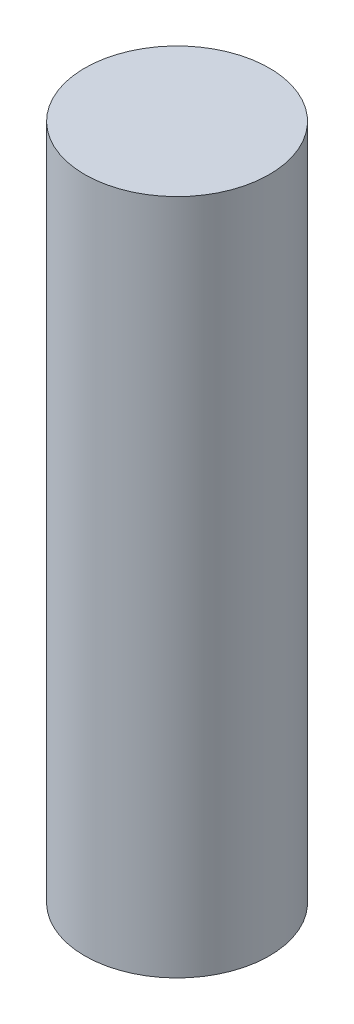
ISO-10303-21;
HEADER;
FILE_DESCRIPTION(('STEP AP214'),'2;1');
FILE_NAME('part.step','',(''),(''),'','','');
FILE_SCHEMA(('AUTOMOTIVE_DESIGN { 1 0 10303 214 1 1 1 1 }'));
ENDSEC;
DATA;
#1=APPLICATION_CONTEXT('core data for automotive mechanical design processes');
#2=APPLICATION_PROTOCOL_DEFINITION('international standard','automotive_design',2000,#1);
#3=PRODUCT_CONTEXT('',#1,'mechanical');
#4=PRODUCT('Part','Part','',(#3));
#5=PRODUCT_RELATED_PRODUCT_CATEGORY('part','',(#4));
#6=PRODUCT_DEFINITION_FORMATION('','',#4);
#7=PRODUCT_DEFINITION_CONTEXT('part definition',#1,'design');
#8=PRODUCT_DEFINITION('design','',#6,#7);
#9=PRODUCT_DEFINITION_SHAPE('','',#8);
#10=(LENGTH_UNIT() NAMED_UNIT(*) SI_UNIT(.MILLI.,.METRE.));
#11=(NAMED_UNIT(*) PLANE_ANGLE_UNIT() SI_UNIT($,.RADIAN.));
#12=(NAMED_UNIT(*) SI_UNIT($,.STERADIAN.) SOLID_ANGLE_UNIT());
#13=UNCERTAINTY_MEASURE_WITH_UNIT(LENGTH_MEASURE(1.E-05),#10,'distance_accuracy_value','');
#14=(GEOMETRIC_REPRESENTATION_CONTEXT(3) GLOBAL_UNCERTAINTY_ASSIGNED_CONTEXT((#13)) GLOBAL_UNIT_ASSIGNED_CONTEXT((#10,
#11,#12)) REPRESENTATION_CONTEXT('',''));
#15=CARTESIAN_POINT('',(0.,0.,0.));
#16=DIRECTION('',(0.,0.,1.));
#17=DIRECTION('',(1.,0.,0.));
#18=AXIS2_PLACEMENT_3D('',#15,#16,#17);
#19=CARTESIAN_POINT('',(0.,11.,0.));
#20=DIRECTION('',(0.,-1.,0.));
#21=DIRECTION('',(0.,0.,-1.));
#22=AXIS2_PLACEMENT_3D('',#19,#20,#21);
#23=CYLINDRICAL_SURFACE('',#22,1.5);
#24=CARTESIAN_POINT('',(0.,11.,0.));
#25=DIRECTION('',(0.,1.,0.));
#26=DIRECTION('',(0.,0.,1.));
#27=AXIS2_PLACEMENT_3D('',#24,#25,#26);
#28=CIRCLE('',#27,1.5);
#29=CARTESIAN_POINT('',(0.,11.,1.5));
#30=VERTEX_POINT('',#29);
#31=EDGE_CURVE('E10',#30,#30,#28,.T.);
#32=ORIENTED_EDGE('',*,*,#31,.F.);
#33=EDGE_LOOP('',(#32));
#34=FACE_BOUND('',#33,.T.);
#35=CARTESIAN_POINT('',(0.,0.,0.));
#36=DIRECTION('',(0.,1.,0.));
#37=DIRECTION('',(0.,0.,1.));
#38=AXIS2_PLACEMENT_3D('',#35,#36,#37);
#39=CIRCLE('',#38,1.5);
#40=CARTESIAN_POINT('',(0.,0.,1.5));
#41=VERTEX_POINT('',#40);
#42=EDGE_CURVE('E40',#41,#41,#39,.T.);
#43=ORIENTED_EDGE('',*,*,#42,.T.);
#44=EDGE_LOOP('',(#43));
#45=FACE_BOUND('',#44,.T.);
#46=ADVANCED_FACE('F37',(#34,#45),#23,.T.);
#47=CARTESIAN_POINT('',(0.,11.,0.));
#48=DIRECTION('',(0.,1.,0.));
#49=DIRECTION('',(0.,0.,1.));
#50=AXIS2_PLACEMENT_3D('',#47,#48,#49);
#51=PLANE('',#50);
#52=ORIENTED_EDGE('',*,*,#31,.T.);
#53=EDGE_LOOP('',(#52));
#54=FACE_BOUND('',#53,.T.);
#55=ADVANCED_FACE('F52',(#54),#51,.T.);
#56=CARTESIAN_POINT('',(0.,0.,0.));
#57=DIRECTION('',(0.,1.,0.));
#58=DIRECTION('',(0.,0.,1.));
#59=AXIS2_PLACEMENT_3D('',#56,#57,#58);
#60=PLANE('',#59);
#61=ORIENTED_EDGE('',*,*,#42,.F.);
#62=EDGE_LOOP('',(#61));
#63=FACE_BOUND('',#62,.T.);
#64=ADVANCED_FACE('F50',(#63),#60,.F.);
#65=CLOSED_SHELL('',(#46,#55,#64));
#66=MANIFOLD_SOLID_BREP('B2',#65);
#67=ADVANCED_BREP_SHAPE_REPRESENTATION('',(#18,#66),#14);
#68=SHAPE_DEFINITION_REPRESENTATION(#9,#67);
ENDSEC;
END-ISO-10303-21;
